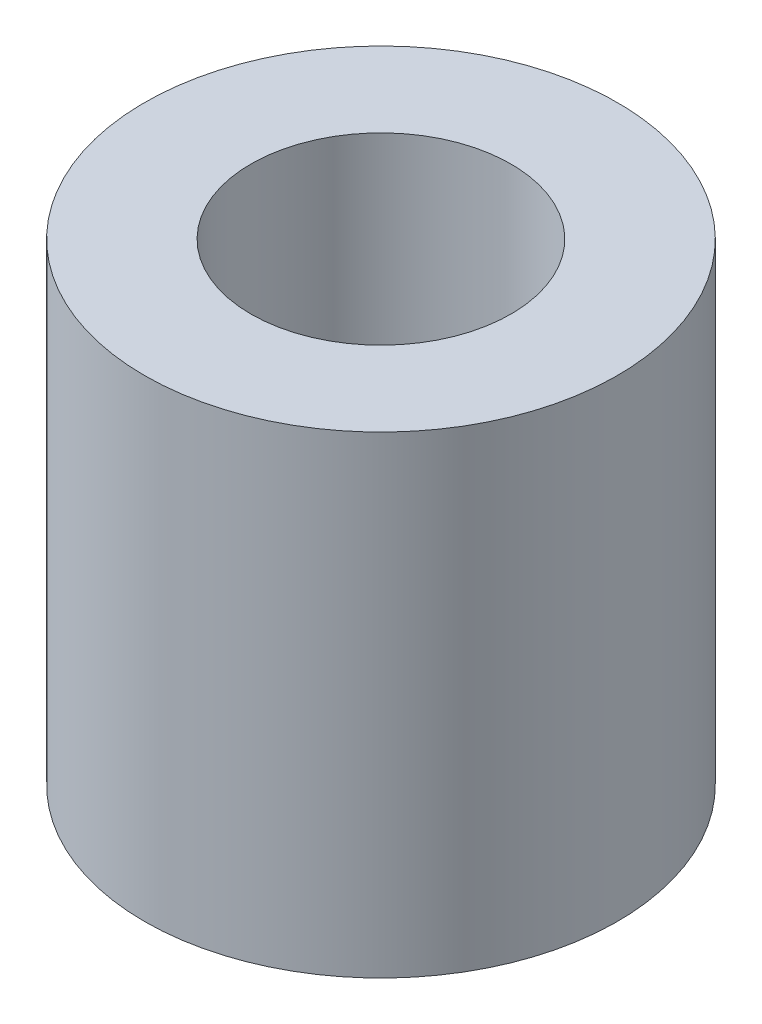
ISO-10303-21;
HEADER;
FILE_DESCRIPTION(('STEP AP214'),'2;1');
FILE_NAME('part.step','',(''),(''),'','','');
FILE_SCHEMA(('AUTOMOTIVE_DESIGN { 1 0 10303 214 1 1 1 1 }'));
ENDSEC;
DATA;
#1=APPLICATION_CONTEXT('core data for automotive mechanical design processes');
#2=APPLICATION_PROTOCOL_DEFINITION('international standard','automotive_design',2000,#1);
#3=PRODUCT_CONTEXT('',#1,'mechanical');
#4=PRODUCT('Part','Part','',(#3));
#5=PRODUCT_RELATED_PRODUCT_CATEGORY('part','',(#4));
#6=PRODUCT_DEFINITION_FORMATION('','',#4);
#7=PRODUCT_DEFINITION_CONTEXT('part definition',#1,'design');
#8=PRODUCT_DEFINITION('design','',#6,#7);
#9=PRODUCT_DEFINITION_SHAPE('','',#8);
#10=(LENGTH_UNIT() NAMED_UNIT(*) SI_UNIT(.MILLI.,.METRE.));
#11=(NAMED_UNIT(*) PLANE_ANGLE_UNIT() SI_UNIT($,.RADIAN.));
#12=(NAMED_UNIT(*) SI_UNIT($,.STERADIAN.) SOLID_ANGLE_UNIT());
#13=UNCERTAINTY_MEASURE_WITH_UNIT(LENGTH_MEASURE(1.E-05),#10,'distance_accuracy_value','');
#14=(GEOMETRIC_REPRESENTATION_CONTEXT(3) GLOBAL_UNCERTAINTY_ASSIGNED_CONTEXT((#13)) GLOBAL_UNIT_ASSIGNED_CONTEXT((#10,
#11,#12)) REPRESENTATION_CONTEXT('',''));
#15=CARTESIAN_POINT('',(0.,0.,0.));
#16=DIRECTION('',(0.,0.,1.));
#17=DIRECTION('',(1.,0.,0.));
#18=AXIS2_PLACEMENT_3D('',#15,#16,#17);
#19=CARTESIAN_POINT('',(0.,4.,0.));
#20=DIRECTION('',(0.,-1.,0.));
#21=DIRECTION('',(0.,0.,-1.));
#22=AXIS2_PLACEMENT_3D('',#19,#20,#21);
#23=CYLINDRICAL_SURFACE('',#22,2.);
#24=CARTESIAN_POINT('',(0.,4.,0.));
#25=DIRECTION('',(0.,1.,0.));
#26=DIRECTION('',(0.,0.,1.));
#27=AXIS2_PLACEMENT_3D('',#24,#25,#26);
#28=CIRCLE('',#27,2.);
#29=CARTESIAN_POINT('',(0.,4.,2.));
#30=VERTEX_POINT('',#29);
#31=EDGE_CURVE('E10',#30,#30,#28,.T.);
#32=ORIENTED_EDGE('',*,*,#31,.F.);
#33=EDGE_LOOP('',(#32));
#34=FACE_BOUND('',#33,.T.);
#35=CARTESIAN_POINT('',(0.,0.,0.));
#36=DIRECTION('',(0.,1.,0.));
#37=DIRECTION('',(0.,0.,1.));
#38=AXIS2_PLACEMENT_3D('',#35,#36,#37);
#39=CIRCLE('',#38,2.);
#40=CARTESIAN_POINT('',(0.,0.,2.));
#41=VERTEX_POINT('',#40);
#42=EDGE_CURVE('E35',#41,#41,#39,.T.);
#43=ORIENTED_EDGE('',*,*,#42,.T.);
#44=EDGE_LOOP('',(#43));
#45=FACE_BOUND('',#44,.T.);
#46=ADVANCED_FACE('F32',(#34,#45),#23,.T.);
#47=CARTESIAN_POINT('',(0.,4.,0.));
#48=DIRECTION('',(0.,1.,0.));
#49=DIRECTION('',(0.,0.,1.));
#50=AXIS2_PLACEMENT_3D('',#47,#48,#49);
#51=PLANE('',#50);
#52=CARTESIAN_POINT('',(0.,4.,0.));
#53=DIRECTION('',(0.,1.,0.));
#54=DIRECTION('',(0.,0.,1.));
#55=AXIS2_PLACEMENT_3D('',#52,#53,#54);
#56=CIRCLE('',#55,1.09999999999999);
#57=CARTESIAN_POINT('',(0.,4.,1.09999999999999));
#58=VERTEX_POINT('',#57);
#59=EDGE_CURVE('E46',#58,#58,#56,.T.);
#60=ORIENTED_EDGE('',*,*,#59,.F.);
#61=EDGE_LOOP('',(#60));
#62=FACE_BOUND('',#61,.T.);
#63=ORIENTED_EDGE('',*,*,#31,.T.);
#64=EDGE_LOOP('',(#63));
#65=FACE_BOUND('',#64,.T.);
#66=ADVANCED_FACE('F53',(#62,#65),#51,.T.);
#67=CARTESIAN_POINT('',(0.,0.,0.));
#68=DIRECTION('',(0.,1.,0.));
#69=DIRECTION('',(0.,0.,1.));
#70=AXIS2_PLACEMENT_3D('',#67,#68,#69);
#71=PLANE('',#70);
#72=CARTESIAN_POINT('',(0.,0.,0.));
#73=DIRECTION('',(0.,1.,0.));
#74=DIRECTION('',(0.,0.,1.));
#75=AXIS2_PLACEMENT_3D('',#72,#73,#74);
#76=CIRCLE('',#75,1.09999999999999);
#77=CARTESIAN_POINT('',(0.,0.,1.09999999999999));
#78=VERTEX_POINT('',#77);
#79=EDGE_CURVE('E42',#78,#78,#76,.T.);
#80=ORIENTED_EDGE('',*,*,#79,.T.);
#81=EDGE_LOOP('',(#80));
#82=FACE_BOUND('',#81,.T.);
#83=ORIENTED_EDGE('',*,*,#42,.F.);
#84=EDGE_LOOP('',(#83));
#85=FACE_BOUND('',#84,.T.);
#86=ADVANCED_FACE('F55',(#82,#85),#71,.F.);
#87=CARTESIAN_POINT('',(0.,4.,0.));
#88=DIRECTION('',(0.,1.,0.));
#89=DIRECTION('',(0.,0.,1.));
#90=AXIS2_PLACEMENT_3D('',#87,#88,#89);
#91=CYLINDRICAL_SURFACE('',#90,1.09999999999999);
#92=ORIENTED_EDGE('',*,*,#59,.T.);
#93=EDGE_LOOP('',(#92));
#94=FACE_BOUND('',#93,.T.);
#95=ORIENTED_EDGE('',*,*,#79,.F.);
#96=EDGE_LOOP('',(#95));
#97=FACE_BOUND('',#96,.T.);
#98=ADVANCED_FACE('F50',(#94,#97),#91,.F.);
#99=CLOSED_SHELL('',(#46,#66,#86,#98));
#100=MANIFOLD_SOLID_BREP('B2',#99);
#101=ADVANCED_BREP_SHAPE_REPRESENTATION('',(#18,#100),#14);
#102=SHAPE_DEFINITION_REPRESENTATION(#9,#101);
ENDSEC;
END-ISO-10303-21;
